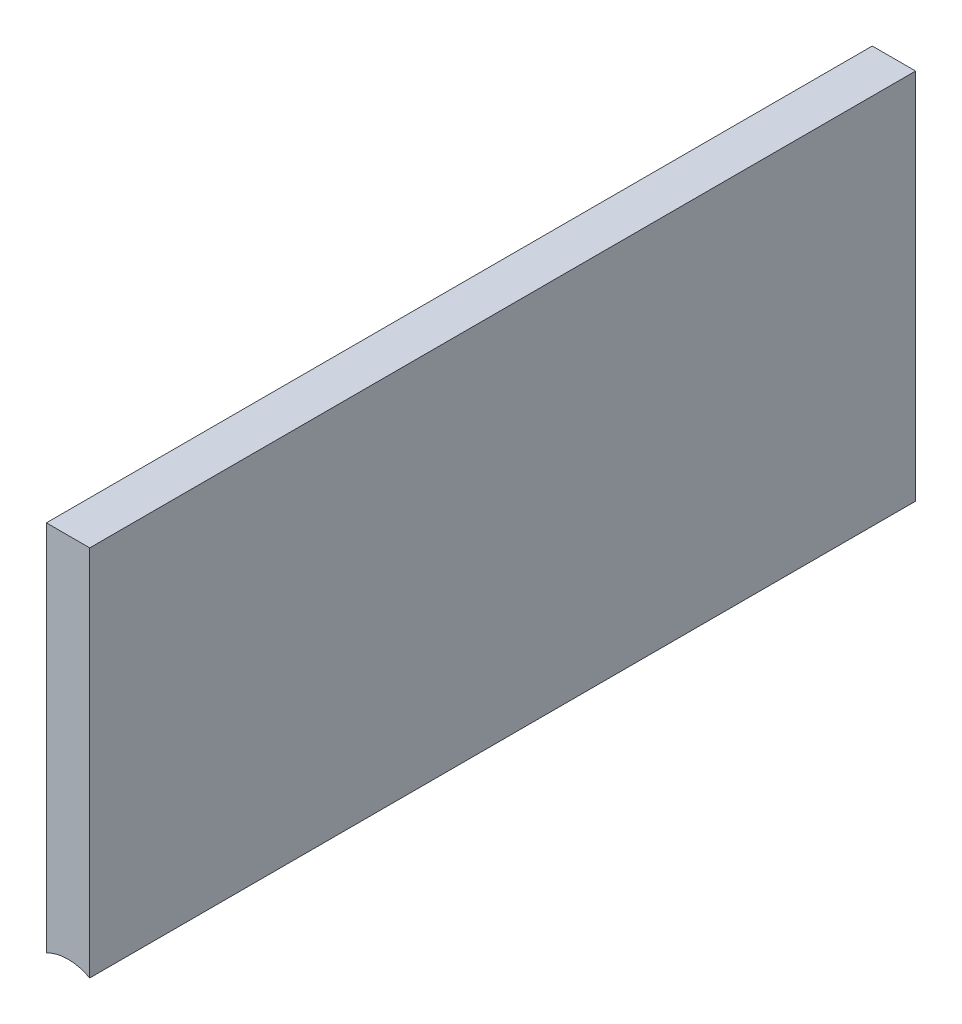
ISO-10303-21;
HEADER;
FILE_DESCRIPTION(('STEP AP214'),'2;1');
FILE_NAME('part.step','',(''),(''),'','','');
FILE_SCHEMA(('AUTOMOTIVE_DESIGN { 1 0 10303 214 1 1 1 1 }'));
ENDSEC;
DATA;
#1=APPLICATION_CONTEXT('core data for automotive mechanical design processes');
#2=APPLICATION_PROTOCOL_DEFINITION('international standard','automotive_design',2000,#1);
#3=PRODUCT_CONTEXT('',#1,'mechanical');
#4=PRODUCT('Part','Part','',(#3));
#5=PRODUCT_RELATED_PRODUCT_CATEGORY('part','',(#4));
#6=PRODUCT_DEFINITION_FORMATION('','',#4);
#7=PRODUCT_DEFINITION_CONTEXT('part definition',#1,'design');
#8=PRODUCT_DEFINITION('design','',#6,#7);
#9=PRODUCT_DEFINITION_SHAPE('','',#8);
#10=(LENGTH_UNIT() NAMED_UNIT(*) SI_UNIT(.MILLI.,.METRE.));
#11=(NAMED_UNIT(*) PLANE_ANGLE_UNIT() SI_UNIT($,.RADIAN.));
#12=(NAMED_UNIT(*) SI_UNIT($,.STERADIAN.) SOLID_ANGLE_UNIT());
#13=UNCERTAINTY_MEASURE_WITH_UNIT(LENGTH_MEASURE(1.E-05),#10,'distance_accuracy_value','');
#14=(GEOMETRIC_REPRESENTATION_CONTEXT(3) GLOBAL_UNCERTAINTY_ASSIGNED_CONTEXT((#13)) GLOBAL_UNIT_ASSIGNED_CONTEXT((#10,
#11,#12)) REPRESENTATION_CONTEXT('',''));
#15=CARTESIAN_POINT('',(0.,0.,0.));
#16=DIRECTION('',(0.,0.,1.));
#17=DIRECTION('',(1.,0.,0.));
#18=AXIS2_PLACEMENT_3D('',#15,#16,#17);
#19=CARTESIAN_POINT('',(3.,0.,0.));
#20=DIRECTION('',(0.,0.,-1.));
#21=DIRECTION('',(-1.,0.,0.));
#22=AXIS2_PLACEMENT_3D('',#19,#20,#21);
#23=PLANE('',#22);
#24=DIRECTION('',(0.,-1.,0.));
#25=VECTOR('',#24,1.);
#26=CARTESIAN_POINT('',(0.,0.,0.));
#27=LINE('',#26,#25);
#28=CARTESIAN_POINT('',(0.,25.4,0.));
#29=VERTEX_POINT('',#28);
#30=CARTESIAN_POINT('',(0.,-0.376674607912797,0.));
#31=VERTEX_POINT('',#30);
#32=EDGE_CURVE('E102',#29,#31,#27,.T.);
#33=ORIENTED_EDGE('',*,*,#32,.T.);
#34=CARTESIAN_POINT('',(1.5,-3.175,0.));
#35=DIRECTION('',(0.,0.,1.));
#36=DIRECTION('',(1.,0.,0.));
#37=AXIS2_PLACEMENT_3D('',#34,#35,#36);
#38=CIRCLE('',#37,3.175);
#39=CARTESIAN_POINT('',(3.,-0.376674607912796,0.));
#40=VERTEX_POINT('',#39);
#41=EDGE_CURVE('E114',#40,#31,#38,.T.);
#42=ORIENTED_EDGE('',*,*,#41,.F.);
#43=DIRECTION('',(0.,-1.,0.));
#44=VECTOR('',#43,1.);
#45=CARTESIAN_POINT('',(3.,0.,0.));
#46=LINE('',#45,#44);
#47=CARTESIAN_POINT('',(3.,25.4,0.));
#48=VERTEX_POINT('',#47);
#49=EDGE_CURVE('E119',#48,#40,#46,.T.);
#50=ORIENTED_EDGE('',*,*,#49,.F.);
#51=DIRECTION('',(-1.,0.,0.));
#52=VECTOR('',#51,1.);
#53=CARTESIAN_POINT('',(3.,25.4,0.));
#54=LINE('',#53,#52);
#55=EDGE_CURVE('E63',#48,#29,#54,.T.);
#56=ORIENTED_EDGE('',*,*,#55,.T.);
#57=EDGE_LOOP('',(#33,#42,#50,#56));
#58=FACE_BOUND('',#57,.T.);
#59=ADVANCED_FACE('F55',(#58),#23,.F.);
#60=CARTESIAN_POINT('',(3.,0.,-57.15));
#61=DIRECTION('',(0.,0.,1.));
#62=DIRECTION('',(1.,0.,0.));
#63=AXIS2_PLACEMENT_3D('',#60,#61,#62);
#64=PLANE('',#63);
#65=DIRECTION('',(0.,1.,0.));
#66=VECTOR('',#65,1.);
#67=CARTESIAN_POINT('',(0.,0.,-57.15));
#68=LINE('',#67,#66);
#69=CARTESIAN_POINT('',(0.,-0.376674607912797,-57.15));
#70=VERTEX_POINT('',#69);
#71=CARTESIAN_POINT('',(0.,25.4,-57.15));
#72=VERTEX_POINT('',#71);
#73=EDGE_CURVE('E82',#70,#72,#68,.T.);
#74=ORIENTED_EDGE('',*,*,#73,.T.);
#75=DIRECTION('',(-1.,0.,0.));
#76=VECTOR('',#75,1.);
#77=CARTESIAN_POINT('',(3.,25.4,-57.15));
#78=LINE('',#77,#76);
#79=CARTESIAN_POINT('',(3.,25.4,-57.15));
#80=VERTEX_POINT('',#79);
#81=EDGE_CURVE('E12',#80,#72,#78,.T.);
#82=ORIENTED_EDGE('',*,*,#81,.F.);
#83=DIRECTION('',(0.,1.,0.));
#84=VECTOR('',#83,1.);
#85=CARTESIAN_POINT('',(3.,0.,-57.15));
#86=LINE('',#85,#84);
#87=CARTESIAN_POINT('',(3.,-0.376674607912796,-57.15));
#88=VERTEX_POINT('',#87);
#89=EDGE_CURVE('E86',#88,#80,#86,.T.);
#90=ORIENTED_EDGE('',*,*,#89,.F.);
#91=CARTESIAN_POINT('',(1.5,-3.175,-57.15));
#92=DIRECTION('',(0.,0.,1.));
#93=DIRECTION('',(1.,0.,0.));
#94=AXIS2_PLACEMENT_3D('',#91,#92,#93);
#95=CIRCLE('',#94,3.175);
#96=EDGE_CURVE('E104',#70,#88,#95,.F.);
#97=ORIENTED_EDGE('',*,*,#96,.F.);
#98=EDGE_LOOP('',(#74,#82,#90,#97));
#99=FACE_BOUND('',#98,.T.);
#100=ADVANCED_FACE('F105',(#99),#64,.F.);
#101=CARTESIAN_POINT('',(3.,25.4,0.));
#102=DIRECTION('',(0.,-1.,0.));
#103=DIRECTION('',(0.,0.,-1.));
#104=AXIS2_PLACEMENT_3D('',#101,#102,#103);
#105=PLANE('',#104);
#106=DIRECTION('',(0.,0.,1.));
#107=VECTOR('',#106,1.);
#108=CARTESIAN_POINT('',(0.,25.4,0.));
#109=LINE('',#108,#107);
#110=EDGE_CURVE('E101',#72,#29,#109,.T.);
#111=ORIENTED_EDGE('',*,*,#110,.T.);
#112=ORIENTED_EDGE('',*,*,#55,.F.);
#113=DIRECTION('',(0.,0.,1.));
#114=VECTOR('',#113,1.);
#115=CARTESIAN_POINT('',(3.,25.4,0.));
#116=LINE('',#115,#114);
#117=EDGE_CURVE('E71',#80,#48,#116,.T.);
#118=ORIENTED_EDGE('',*,*,#117,.F.);
#119=ORIENTED_EDGE('',*,*,#81,.T.);
#120=EDGE_LOOP('',(#111,#112,#118,#119));
#121=FACE_BOUND('',#120,.T.);
#122=ADVANCED_FACE('F128',(#121),#105,.F.);
#123=CARTESIAN_POINT('',(3.,0.,0.));
#124=DIRECTION('',(-1.,0.,0.));
#125=DIRECTION('',(0.,0.,1.));
#126=AXIS2_PLACEMENT_3D('',#123,#124,#125);
#127=PLANE('',#126);
#128=ORIENTED_EDGE('',*,*,#49,.T.);
#129=DIRECTION('',(0.,0.,1.));
#130=VECTOR('',#129,1.);
#131=CARTESIAN_POINT('',(3.,-0.376674607912796,-58.696571614975));
#132=LINE('',#131,#130);
#133=EDGE_CURVE('E109',#88,#40,#132,.T.);
#134=ORIENTED_EDGE('',*,*,#133,.F.);
#135=ORIENTED_EDGE('',*,*,#89,.T.);
#136=ORIENTED_EDGE('',*,*,#117,.T.);
#137=EDGE_LOOP('',(#128,#134,#135,#136));
#138=FACE_BOUND('',#137,.T.);
#139=ADVANCED_FACE('F130',(#138),#127,.F.);
#140=CARTESIAN_POINT('',(0.,0.,0.));
#141=DIRECTION('',(-1.,0.,0.));
#142=DIRECTION('',(0.,0.,1.));
#143=AXIS2_PLACEMENT_3D('',#140,#141,#142);
#144=PLANE('',#143);
#145=ORIENTED_EDGE('',*,*,#32,.F.);
#146=ORIENTED_EDGE('',*,*,#110,.F.);
#147=ORIENTED_EDGE('',*,*,#73,.F.);
#148=DIRECTION('',(0.,0.,1.));
#149=VECTOR('',#148,1.);
#150=CARTESIAN_POINT('',(0.,-0.376674607912797,-58.696571614975));
#151=LINE('',#150,#149);
#152=EDGE_CURVE('E100',#70,#31,#151,.T.);
#153=ORIENTED_EDGE('',*,*,#152,.T.);
#154=EDGE_LOOP('',(#145,#146,#147,#153));
#155=FACE_BOUND('',#154,.T.);
#156=ADVANCED_FACE('F98',(#155),#144,.T.);
#157=CARTESIAN_POINT('',(1.5,-3.175,-58.696571614975));
#158=DIRECTION('',(0.,0.,1.));
#159=DIRECTION('',(1.,0.,0.));
#160=AXIS2_PLACEMENT_3D('',#157,#158,#159);
#161=CYLINDRICAL_SURFACE('',#160,3.175);
#162=ORIENTED_EDGE('',*,*,#41,.T.);
#163=ORIENTED_EDGE('',*,*,#152,.F.);
#164=ORIENTED_EDGE('',*,*,#96,.T.);
#165=ORIENTED_EDGE('',*,*,#133,.T.);
#166=EDGE_LOOP('',(#162,#163,#164,#165));
#167=FACE_BOUND('',#166,.T.);
#168=ADVANCED_FACE('F112',(#167),#161,.F.);
#169=CLOSED_SHELL('',(#59,#100,#122,#139,#156,#168));
#170=MANIFOLD_SOLID_BREP('B2',#169);
#171=ADVANCED_BREP_SHAPE_REPRESENTATION('',(#18,#170),#14);
#172=SHAPE_DEFINITION_REPRESENTATION(#9,#171);
ENDSEC;
END-ISO-10303-21;
